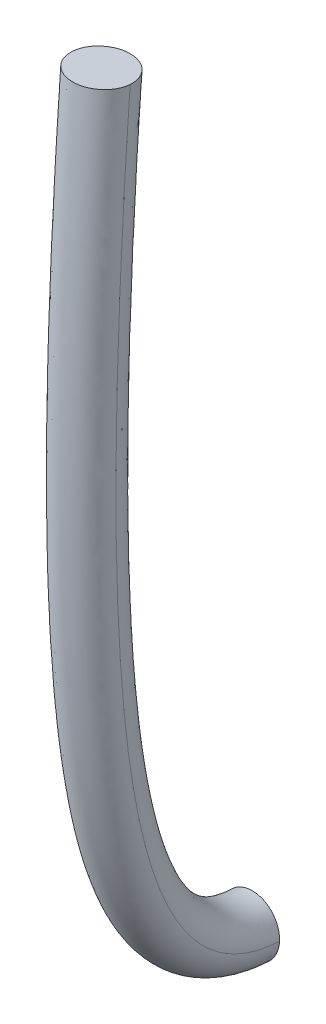
ISO-10303-21;
HEADER;
FILE_DESCRIPTION(('STEP AP214'),'2;1');
FILE_NAME('part.step','',(''),(''),'','','');
FILE_SCHEMA(('AUTOMOTIVE_DESIGN { 1 0 10303 214 1 1 1 1 }'));
ENDSEC;
DATA;
#1=APPLICATION_CONTEXT('core data for automotive mechanical design processes');
#2=APPLICATION_PROTOCOL_DEFINITION('international standard','automotive_design',2000,#1);
#3=PRODUCT_CONTEXT('',#1,'mechanical');
#4=PRODUCT('Part','Part','',(#3));
#5=PRODUCT_RELATED_PRODUCT_CATEGORY('part','',(#4));
#6=PRODUCT_DEFINITION_FORMATION('','',#4);
#7=PRODUCT_DEFINITION_CONTEXT('part definition',#1,'design');
#8=PRODUCT_DEFINITION('design','',#6,#7);
#9=PRODUCT_DEFINITION_SHAPE('','',#8);
#10=(LENGTH_UNIT() NAMED_UNIT(*) SI_UNIT(.MILLI.,.METRE.));
#11=(NAMED_UNIT(*) PLANE_ANGLE_UNIT() SI_UNIT($,.RADIAN.));
#12=(NAMED_UNIT(*) SI_UNIT($,.STERADIAN.) SOLID_ANGLE_UNIT());
#13=UNCERTAINTY_MEASURE_WITH_UNIT(LENGTH_MEASURE(1.E-05),#10,'distance_accuracy_value','');
#14=(GEOMETRIC_REPRESENTATION_CONTEXT(3) GLOBAL_UNCERTAINTY_ASSIGNED_CONTEXT((#13)) GLOBAL_UNIT_ASSIGNED_CONTEXT((#10,
#11,#12)) REPRESENTATION_CONTEXT('',''));
#15=CARTESIAN_POINT('',(0.,0.,0.));
#16=DIRECTION('',(0.,0.,1.));
#17=DIRECTION('',(1.,0.,0.));
#18=AXIS2_PLACEMENT_3D('',#15,#16,#17);
#19=CARTESIAN_POINT('',(-5.27289548724263,-7.28816544707048,13.8273298786737));
#20=CARTESIAN_POINT('',(-5.27289548724283,-7.27979947720606,13.9789787887425));
#21=CARTESIAN_POINT('',(-5.27289548724304,-7.19249943748985,14.2453726569304));
#22=CARTESIAN_POINT('',(-5.27289548724291,-6.82519562726373,14.5758428394149));
#23=CARTESIAN_POINT('',(-5.27289548724253,-6.16590455961052,14.8229446631191));
#24=CARTESIAN_POINT('',(-5.27289548724203,-5.06040179765682,14.9938956540655));
#25=CARTESIAN_POINT('',(-5.27289548724174,-3.38307014562794,15.0377995934823));
#26=CARTESIAN_POINT('',(-5.2728954872422,-1.84086870404001,14.9634806209142));
#27=CARTESIAN_POINT('',(-5.27289548724264,-1.00711460021713,14.9025870411617));
#28=CARTESIAN_POINT('',(-5.24379715545668,-7.22780437308972,13.8239999574387));
#29=CARTESIAN_POINT('',(-5.24379715545687,-7.21999159185813,13.9656212849807));
#30=CARTESIAN_POINT('',(-5.24379715545708,-7.14063321352236,14.2083493279636));
#31=CARTESIAN_POINT('',(-5.24379715545696,-6.79716208617297,14.5207896001784));
#32=CARTESIAN_POINT('',(-5.24379715545659,-6.15271535346113,14.7636530596226));
#33=CARTESIAN_POINT('',(-5.24379715545608,-5.05670222485791,14.9333271035938));
#34=CARTESIAN_POINT('',(-5.24379715545579,-3.38436676393499,14.9773480617736));
#35=CARTESIAN_POINT('',(-5.24379715545625,-1.84433177495748,14.9031196746293));
#36=CARTESIAN_POINT('',(-5.24379715545669,-1.01151807092496,14.8422947773688));
#37=CARTESIAN_POINT('',(-5.12729936381137,-7.13477609503237,13.8188678943702));
#38=CARTESIAN_POINT('',(-5.12729936381156,-7.1278155258013,13.9450412794592));
#39=CARTESIAN_POINT('',(-5.12729936381177,-7.06070215217801,14.1512961166985));
#40=CARTESIAN_POINT('',(-5.12729936381164,-6.75395266235516,14.4359557447663));
#41=CARTESIAN_POINT('',(-5.12729936381127,-6.1323830565793,14.6722810375099));
#42=CARTESIAN_POINT('',(-5.12729936381076,-5.05099597114022,14.839984442192));
#43=CARTESIAN_POINT('',(-5.12729936381048,-3.38636104659434,14.8841829340363));
#44=CARTESIAN_POINT('',(-5.12729936381093,-1.84966966052763,14.810091638123));
#45=CARTESIAN_POINT('',(-5.12729936381137,-1.01830468472103,14.7493725493346));
#46=CARTESIAN_POINT('',(-4.90938459812554,-7.18477729038485,13.8216262952934));
#47=CARTESIAN_POINT('',(-4.90938459812573,-7.17735938022325,13.9560898433595));
#48=CARTESIAN_POINT('',(-4.90938459812594,-7.10365399861126,14.1819474903361));
#49=CARTESIAN_POINT('',(-4.90938459812582,-6.77718534823178,14.4815250076562));
#50=CARTESIAN_POINT('',(-4.90938459812544,-6.14332144866162,14.7213762950583));
#51=CARTESIAN_POINT('',(-4.90938459812494,-5.05407181620375,14.8901440287118));
#52=CARTESIAN_POINT('',(-4.90938459812465,-3.38529714355021,14.934252639231));
#53=CARTESIAN_POINT('',(-4.9093845981251,-1.84679942765478,14.8600926155881));
#54=CARTESIAN_POINT('',(-4.90938459812555,-1.01465698953308,14.7993167445143));
#55=CARTESIAN_POINT('',(-4.84500000000135,-7.31847179552639,13.8290017798951));
#56=CARTESIAN_POINT('',(-4.84500000000155,-7.30982729388697,13.9856996012998));
#57=CARTESIAN_POINT('',(-4.84500000000175,-7.21855150146373,14.2639767583375));
#58=CARTESIAN_POINT('',(-4.84500000000162,-6.83926162727762,14.6035146924663));
#59=CARTESIAN_POINT('',(-4.84500000000125,-6.17251546983433,14.8527314417126));
#60=CARTESIAN_POINT('',(-4.84500000000075,-5.06224953339507,15.0243178802794));
#61=CARTESIAN_POINT('',(-4.84500000000046,-3.382410294947,15.0681569388591));
#62=CARTESIAN_POINT('',(-4.84500000000091,-1.83913128396928,14.99378700265));
#63=CARTESIAN_POINT('',(-4.84500000000136,-1.00490368664486,14.9328588411016));
#64=CARTESIAN_POINT('',(-4.845,-7.38568943191456,13.8327099550486));
#65=CARTESIAN_POINT('',(-4.84500000000019,-7.37642950308164,14.0005635497388));
#66=CARTESIAN_POINT('',(-4.84500000000039,-7.27630104779425,14.3051939892497));
#67=CARTESIAN_POINT('',(-4.84500000000026,-6.87048659892043,14.6647982664477));
#68=CARTESIAN_POINT('',(-4.84499999999989,-6.18721141687725,14.9187448304369));
#69=CARTESIAN_POINT('',(-4.84499999999939,-5.06637680995733,15.0917576140227));
#70=CARTESIAN_POINT('',(-4.8449999999991,-3.38097314559669,15.1354710442543));
#71=CARTESIAN_POINT('',(-4.84499999999955,-1.83527381521949,15.0610044224056));
#72=CARTESIAN_POINT('',(-4.845,-1.00000001490137,14.9999998509838));
#73=B_SPLINE_SURFACE_WITH_KNOTS('',3,3,((#19,#20,#21,#22,#23,#24,#25,#26,#27),(#28,#29,#30,#31,
#32,#33,#34,#35,#36),(#37,#38,#39,#40,#41,#42,#43,#44,#45),(#46,#47,#48,#49,#50,#51,#52,#53,
#54),(#55,#56,#57,#58,#59,#60,#61,#62,#63),(#64,#65,#66,#67,#68,#69,#70,#71,#72)),.UNSPECIFIED.,
.F.,.F.,.F.,(4,1,1,4),(4,1,1,1,1,1,4),(0.448798950512828,1.34639685153848,2.24399475256414,
3.14159265358979),(0.,0.142857142857143,0.285714285714286,0.428571428571429,0.571428571428571,
0.785714285714286,1.),.UNSPECIFIED.);
#74=CARTESIAN_POINT('',(-4.845,-7.38568943191456,13.8327099550486));
#75=CARTESIAN_POINT('',(-4.84500000000019,-7.37642950308164,14.0005635497388));
#76=CARTESIAN_POINT('',(-4.84500000000039,-7.27630104779425,14.3051939892497));
#77=CARTESIAN_POINT('',(-4.84500000000026,-6.87048659892043,14.6647982664477));
#78=CARTESIAN_POINT('',(-4.84499999999989,-6.18721141687725,14.9187448304369));
#79=CARTESIAN_POINT('',(-4.84499999999939,-5.06637680995733,15.0917576140227));
#80=CARTESIAN_POINT('',(-4.8449999999991,-3.38097314559669,15.1354710442543));
#81=CARTESIAN_POINT('',(-4.84499999999955,-1.83527381521949,15.0610044224056));
#82=CARTESIAN_POINT('',(-4.845,-1.00000001490137,14.9999998509838));
#83=B_SPLINE_CURVE_WITH_KNOTS('',3,(#74,#75,#76,#77,#78,#79,#80,#81,#82),.UNSPECIFIED.,.F.,.F.,
(4,1,1,1,1,1,4),(0.,0.142857142857143,0.285714285714286,0.428571428571429,0.571428571428571,
0.785714285714286,1.),.UNSPECIFIED.);
#84=CARTESIAN_POINT('',(-4.845,-7.38568943191456,13.8327099550486));
#85=VERTEX_POINT('',#84);
#86=CARTESIAN_POINT('',(-4.845,-1.00000001490137,14.9999998509838));
#87=VERTEX_POINT('',#86);
#88=EDGE_CURVE('E11',#85,#87,#83,.T.);
#89=CARTESIAN_POINT('',(-4.845,-7.38568943191456,13.8327099550486));
#90=CARTESIAN_POINT('',(-4.84497847415767,-7.4110270881352,13.8341077499176));
#91=CARTESIAN_POINT('',(-4.84947322099431,-7.43643730784373,13.8355095478747));
#92=CARTESIAN_POINT('',(-4.86641979035294,-7.48438622869311,13.8381547315867));
#93=CARTESIAN_POINT('',(-4.87886645637275,-7.50692677934839,13.8393982193732));
#94=CARTESIAN_POINT('',(-4.91068341580595,-7.54640620250965,13.8415761688506));
#95=CARTESIAN_POINT('',(-4.93004036434348,-7.56335575159643,13.8425112195332));
#96=CARTESIAN_POINT('',(-4.97308062026943,-7.58995895352275,13.8439788303819));
#97=CARTESIAN_POINT('',(-4.99673568981949,-7.599658228531,13.8445139073724));
#98=CARTESIAN_POINT('',(-5.04600153650225,-7.61052254998054,13.84511325613));
#99=CARTESIAN_POINT('',(-5.07161741475389,-7.61166451545368,13.8451762545961));
#100=CARTESIAN_POINT('',(-5.12188710178593,-7.60564066732368,13.8448439387759));
#101=CARTESIAN_POINT('',(-5.14653941385386,-7.59846242170475,13.8444479386563));
#102=CARTESIAN_POINT('',(-5.19200107952252,-7.57620585424343,13.8432201172852));
#103=CARTESIAN_POINT('',(-5.21280462824726,-7.56111572866897,13.8423876448609));
#104=CARTESIAN_POINT('',(-5.24850403886139,-7.5249538193773,13.8403927116745));
#105=CARTESIAN_POINT('',(-5.26337649945534,-7.50385889334491,13.8392289742272));
#106=CARTESIAN_POINT('',(-5.28455500615893,-7.45822808230441,13.8367116729826));
#107=CARTESIAN_POINT('',(-5.29102975924534,-7.43377124817415,13.8353624701613));
#108=CARTESIAN_POINT('',(-5.29479265193478,-7.3965248169106,13.8333077074771));
#109=CARTESIAN_POINT('',(-5.29503698930088,-7.38393139287266,13.8326129698364));
#110=CARTESIAN_POINT('',(-5.29350194394068,-7.3588565987858,13.8312296762038));
#111=CARTESIAN_POINT('',(-5.29172358135648,-7.34637517544837,13.8305411172722));
#112=CARTESIAN_POINT('',(-5.28600529502433,-7.32135603600862,13.8291608939228));
#113=CARTESIAN_POINT('',(-5.28197761729317,-7.30883802486994,13.8284703165628));
#114=CARTESIAN_POINT('',(-5.27166559762405,-7.28476924270971,13.827142521288));
#115=CARTESIAN_POINT('',(-5.26538268387071,-7.27321786523924,13.8265052699173));
#116=CARTESIAN_POINT('',(-5.25138744901714,-7.25220867643668,13.8253462623101));
#117=CARTESIAN_POINT('',(-5.24380998711596,-7.24266012748231,13.8248195003784));
#118=CARTESIAN_POINT('',(-5.22724507533855,-7.22485215564251,13.8238370933457));
#119=CARTESIAN_POINT('',(-5.21825573172552,-7.21659449432438,13.8233815454245));
#120=CARTESIAN_POINT('',(-5.19850548617428,-7.20109607502702,13.8225265487831));
#121=CARTESIAN_POINT('',(-5.18766897456367,-7.19395113600727,13.8221323860786));
#122=CARTESIAN_POINT('',(-5.16496216225167,-7.18157859046832,13.8214498335757));
#123=CARTESIAN_POINT('',(-5.15309336245596,-7.17634825601238,13.8211612932861));
#124=CARTESIAN_POINT('',(-5.12865935246965,-7.16811847106196,13.8207072832121));
#125=CARTESIAN_POINT('',(-5.11609777377959,-7.16510839174327,13.8205412270706));
#126=CARTESIAN_POINT('',(-5.09063463906853,-7.161401132664,13.8203367098227));
#127=CARTESIAN_POINT('',(-5.0777328737575,-7.16070541186808,13.8202983292026));
#128=CARTESIAN_POINT('',(-5.05271571352024,-7.16145742012051,13.820339815016));
#129=CARTESIAN_POINT('',(-5.04059625347407,-7.1627888524724,13.8204132657445));
#130=CARTESIAN_POINT('',(-5.01670425063249,-7.16730878514178,13.8206626155123));
#131=CARTESIAN_POINT('',(-5.00493188921285,-7.17049823890927,13.8208385671502));
#132=CARTESIAN_POINT('',(-4.98111915635603,-7.17899409206104,13.8213072553288));
#133=CARTESIAN_POINT('',(-4.96913068832415,-7.18444742351354,13.8216080976267));
#134=CARTESIAN_POINT('',(-4.94632125863665,-7.19737198447044,13.8223211029983));
#135=CARTESIAN_POINT('',(-4.93549865874493,-7.20484032939948,13.8227331069395));
#136=CARTESIAN_POINT('',(-4.90644720602132,-7.22920390930079,13.8240771652329));
#137=CARTESIAN_POINT('',(-4.89023438705608,-7.24856194734145,13.825145084302));
#138=CARTESIAN_POINT('',(-4.8646410792603,-7.29145296493362,13.8275112401845));
#139=CARTESIAN_POINT('',(-4.85530314657342,-7.31501084571109,13.8288108507163));
#140=CARTESIAN_POINT('',(-4.84672885379226,-7.35460392638949,13.8309950703038));
#141=CARTESIAN_POINT('',(-4.84501321610968,-7.37013300264753,13.8318517581886));
#142=CARTESIAN_POINT('',(-4.845,-7.38568943191456,13.8327099550486));
#143=B_SPLINE_CURVE_WITH_KNOTS('',3,(#89,#90,#91,#92,#93,#94,#95,#96,#97,#98,#99,#100,#101,#102,
#103,#104,#105,#106,#107,#108,#109,#110,#111,#112,#113,#114,#115,#116,#117,#118,#119,#120,#121,
#122,#123,#124,#125,#126,#127,#128,#129,#130,#131,#132,#133,#134,#135,#136,#137,#138,#139,#140,
#141,#142),.UNSPECIFIED.,.T.,.F.,(4,2,2,2,2,2,2,2,2,2,2,2,2,2,2,2,2,2,2,2,2,2,2,2,2,2,4),(0.,
0.0759556944633894,0.151862184614655,0.227622873027156,0.302902730628832,0.378385561922837,
0.453981324819257,0.529690191288069,0.605694882282272,0.680147726911943,0.717871934830117,
0.755577125100554,0.794867909351082,0.834133855500916,0.870583238371331,0.907081934487411,
0.945861906182154,0.984586406940069,1.0231243004168,1.06168648346651,1.09811820249087,
1.13456863306412,1.17388958466093,1.2131545426347,1.28748095512165,1.36226367279545,
1.40889779625419),.UNSPECIFIED.);
#144=CARTESIAN_POINT('',(-5.27289548724264,-7.28816544707048,13.8273298786738));
#145=VERTEX_POINT('',#144);
#146=EDGE_CURVE('E45',#145,#85,#143,.T.);
#147=CARTESIAN_POINT('',(-5.27289548724263,-7.28816544707048,13.8273298786737));
#148=CARTESIAN_POINT('',(-5.27289548724283,-7.27979947720606,13.9789787887425));
#149=CARTESIAN_POINT('',(-5.27289548724304,-7.19249943748985,14.2453726569304));
#150=CARTESIAN_POINT('',(-5.27289548724291,-6.82519562726373,14.5758428394149));
#151=CARTESIAN_POINT('',(-5.27289548724253,-6.16590455961052,14.8229446631191));
#152=CARTESIAN_POINT('',(-5.27289548724203,-5.06040179765682,14.9938956540655));
#153=CARTESIAN_POINT('',(-5.27289548724174,-3.38307014562794,15.0377995934823));
#154=CARTESIAN_POINT('',(-5.2728954872422,-1.84086870404001,14.9634806209142));
#155=CARTESIAN_POINT('',(-5.27289548724264,-1.00711460021713,14.9025870411617));
#156=B_SPLINE_CURVE_WITH_KNOTS('',3,(#147,#148,#149,#150,#151,#152,#153,#154,#155),
.UNSPECIFIED.,.F.,.F.,(4,1,1,1,1,1,4),(0.,0.142857142857143,0.285714285714286,0.428571428571429,
0.571428571428571,0.785714285714286,1.),.UNSPECIFIED.);
#157=CARTESIAN_POINT('',(-5.27289548724264,-1.00711460021713,14.9025870411617));
#158=VERTEX_POINT('',#157);
#159=EDGE_CURVE('E29',#145,#158,#156,.T.);
#160=CARTESIAN_POINT('',(-4.845,-1.00000001490137,14.9999998509838));
#161=CARTESIAN_POINT('',(-4.84501097548697,-1.00092508162962,14.9873338493442));
#162=CARTESIAN_POINT('',(-4.84615103910393,-1.00185042185208,14.9746641030254));
#163=CARTESIAN_POINT('',(-4.85057441529783,-1.00367505966439,14.9496811857757));
#164=CARTESIAN_POINT('',(-4.85386279374645,-1.00457429043847,14.9373689296853));
#165=CARTESIAN_POINT('',(-4.86239293289763,-1.00631909170807,14.9134791333424));
#166=CARTESIAN_POINT('',(-4.86762901994641,-1.00716480979378,14.9018995722867));
#167=CARTESIAN_POINT('',(-4.87991155634525,-1.00878259827519,14.8797488333917));
#168=CARTESIAN_POINT('',(-4.88695673625286,-1.00955471979483,14.8691769555638));
#169=CARTESIAN_POINT('',(-4.90296394381425,-1.01102540400624,14.8490403664247));
#170=CARTESIAN_POINT('',(-4.91197814860759,-1.01172098317568,14.8395165054626));
#171=CARTESIAN_POINT('',(-4.93161542803285,-1.01297832832624,14.8223009519764));
#172=CARTESIAN_POINT('',(-4.94223741689136,-1.01354018396016,14.8146080319274));
#173=CARTESIAN_POINT('',(-4.96388981259282,-1.01448281005278,14.8017016076989));
#174=CARTESIAN_POINT('',(-4.97484008463752,-1.01487347616387,14.7963526123751));
#175=CARTESIAN_POINT('',(-4.9974571169487,-1.01552564828865,14.7874230801053));
#176=CARTESIAN_POINT('',(-5.00912483838782,-1.0157869765939,14.7838449763409));
#177=CARTESIAN_POINT('',(-5.03360600506706,-1.01618688204226,14.7783694761313));
#178=CARTESIAN_POINT('',(-5.04644582012378,-1.01631694204522,14.7765886962585));
#179=CARTESIAN_POINT('',(-5.07223089855849,-1.01641890448108,14.7751926279099));
#180=CARTESIAN_POINT('',(-5.08517598803038,-1.01639102932016,14.7755742942516));
#181=CARTESIAN_POINT('',(-5.1107559093497,-1.01616719134095,14.7786390809586));
#182=CARTESIAN_POINT('',(-5.12339159671446,-1.01597176317861,14.7813148808216));
#183=CARTESIAN_POINT('',(-5.14797181977545,-1.01541775084992,14.7889004104374));
#184=CARTESIAN_POINT('',(-5.15991594296075,-1.01505907041273,14.7938114583293));
#185=CARTESIAN_POINT('',(-5.18216813899399,-1.01422532097814,14.8052271447693));
#186=CARTESIAN_POINT('',(-5.1925302023355,-1.0137578066214,14.8116283452754));
#187=CARTESIAN_POINT('',(-5.21214314082974,-1.01271154012388,14.8259538125833));
#188=CARTESIAN_POINT('',(-5.22139337410771,-1.01213272422369,14.8338789523782));
#189=CARTESIAN_POINT('',(-5.23923657441253,-1.01082663878343,14.8517618572788));
#190=CARTESIAN_POINT('',(-5.24771790313102,-1.01009120115275,14.8618314597751));
#191=CARTESIAN_POINT('',(-5.26275957285925,-1.00852463544684,14.8832808570928));
#192=CARTESIAN_POINT('',(-5.2693227331093,-1.00769365033369,14.8946586944795));
#193=CARTESIAN_POINT('',(-5.28509048720766,-1.00517376824406,14.929160887353));
#194=CARTESIAN_POINT('',(-5.29140041664153,-1.00338278315717,14.9536830319231));
#195=CARTESIAN_POINT('',(-5.29486928820332,-1.00066660641845,14.9908728885849));
#196=CARTESIAN_POINT('',(-5.29501455042498,-0.999752521037453,15.0033885337605));
#197=CARTESIAN_POINT('',(-5.29330708079217,-0.997933353264187,15.0282965553067));
#198=CARTESIAN_POINT('',(-5.29145564744456,-0.997028265406675,15.0406890065074));
#199=CARTESIAN_POINT('',(-5.28560263146055,-0.995209213339131,15.0655954438123));
#200=CARTESIAN_POINT('',(-5.28150164949534,-0.994296926548662,15.0780864627097));
#201=CARTESIAN_POINT('',(-5.27106262898264,-0.992542752751662,15.1021045875762));
#202=CARTESIAN_POINT('',(-5.26472491069036,-0.991700855688086,15.1136318312462));
#203=CARTESIAN_POINT('',(-5.25058602213519,-0.990164780090974,15.1346637583898));
#204=CARTESIAN_POINT('',(-5.24290753683838,-0.989464543865855,15.1442513836979));
#205=CARTESIAN_POINT('',(-5.22611418656071,-0.988162062076395,15.1620849474582));
#206=CARTESIAN_POINT('',(-5.21699876133972,-0.987559854918958,15.1703303600436));
#207=CARTESIAN_POINT('',(-5.19713917791722,-0.986445264874192,15.1855913124736));
#208=CARTESIAN_POINT('',(-5.1863415573968,-0.985937905290243,15.1925380733135));
#209=CARTESIAN_POINT('',(-5.16370073269004,-0.985068044990207,15.2044481892542));
#210=CARTESIAN_POINT('',(-5.15185791530142,-0.984705490957872,15.2094122743604));
#211=CARTESIAN_POINT('',(-5.12775045901683,-0.984138147074207,15.2171803394536));
#212=CARTESIAN_POINT('',(-5.1154992036082,-0.9839303135008,15.2200259940438));
#213=CARTESIAN_POINT('',(-5.09069326615155,-0.983662392091959,15.2236943704969));
#214=CARTESIAN_POINT('',(-5.07813848432628,-0.983602353526329,15.2245164177584));
#215=CARTESIAN_POINT('',(-5.05273623508237,-0.983633609096825,15.2240884668925));
#216=CARTESIAN_POINT('',(-5.03988951372568,-0.983728821503712,15.2227848198528));
#217=CARTESIAN_POINT('',(-5.01462981519077,-0.98408266426306,15.217940009383));
#218=CARTESIAN_POINT('',(-5.00221671500175,-0.984341247866072,15.2143994860459));
#219=CARTESIAN_POINT('',(-4.97854671795792,-0.984998826205311,15.2053959319575));
#220=CARTESIAN_POINT('',(-4.96726627034472,-0.985393362029234,15.1999939525757));
#221=CARTESIAN_POINT('',(-4.94573314611426,-0.986310625632451,15.1874347912226));
#222=CARTESIAN_POINT('',(-4.93548066863452,-0.98683337818245,15.1802772700912));
#223=CARTESIAN_POINT('',(-4.91604587321701,-0.988010407476623,15.1641614002682));
#224=CARTESIAN_POINT('',(-4.90689803825202,-0.988667732742994,15.1551613112503));
#225=CARTESIAN_POINT('',(-4.89032497692097,-0.990087493103763,15.1357219708132));
#226=CARTESIAN_POINT('',(-4.88289963970247,-0.99084992142915,15.1252828120752));
#227=CARTESIAN_POINT('',(-4.86379254477249,-0.993218533901096,15.0928518008441));
#228=CARTESIAN_POINT('',(-4.85470195131041,-0.994942269536303,15.0692504348938));
#229=CARTESIAN_POINT('',(-4.84657118884221,-0.997799847823488,15.0301245100651));
#230=CARTESIAN_POINT('',(-4.84498694572465,-0.99889973790915,15.0150648292842));
#231=CARTESIAN_POINT('',(-4.845,-1.00000001490137,14.9999998509838));
#232=B_SPLINE_CURVE_WITH_KNOTS('',3,(#160,#161,#162,#163,#164,#165,#166,#167,#168,#169,#170,
#171,#172,#173,#174,#175,#176,#177,#178,#179,#180,#181,#182,#183,#184,#185,#186,#187,#188,#189,
#190,#191,#192,#193,#194,#195,#196,#197,#198,#199,#200,#201,#202,#203,#204,#205,#206,#207,#208,
#209,#210,#211,#212,#213,#214,#215,#216,#217,#218,#219,#220,#221,#222,#223,#224,#225,#226,#227,
#228,#229,#230,#231),.UNSPECIFIED.,.T.,.F.,(4,2,2,2,2,2,2,2,2,2,2,2,2,2,2,2,2,2,2,2,2,2,2,2,2,2,
2,2,2,2,2,2,2,2,2,4),(0.,0.038061764108685,0.0762136059710827,0.114255171327303,
0.152270115474761,0.191451348215509,0.230606238062134,0.267030675037744,0.303505020726774,
0.342217718461339,0.380875914076636,0.419411209872623,0.457969259665665,0.494389744761906,
0.530831155928446,0.570185415776522,0.609481540171978,0.683954133489126,0.721494140508779,
0.759009748927744,0.798334817127501,0.837654257058905,0.874404473940575,0.911169054750214,
0.949526795126805,0.987870399441666,1.0254381708938,1.06301846446157,1.10156198341511,
1.14009447794859,1.17746757477839,1.21484789756168,1.25319376372407,1.29153716142892,
1.36604622970107,1.41131699996353),.UNSPECIFIED.);
#233=EDGE_CURVE('E48',#87,#158,#232,.T.);
#234=ORIENTED_EDGE('',*,*,#88,.F.);
#235=ORIENTED_EDGE('',*,*,#146,.F.);
#236=ORIENTED_EDGE('',*,*,#159,.T.);
#237=ORIENTED_EDGE('',*,*,#233,.F.);
#238=EDGE_LOOP('',(#234,#235,#236,#237));
#239=FACE_BOUND('',#238,.T.);
#240=ADVANCED_FACE('F17',(#239),#73,.F.);
#241=CARTESIAN_POINT('',(-5.07,-1.00000001490116,14.9999998509884));
#242=DIRECTION('',(5.3263280686712E-13,-0.997343536648528,0.0728414024124084));
#243=DIRECTION('',(0.,-0.0728414024124084,-0.997343536648528));
#244=AXIS2_PLACEMENT_3D('',#241,#242,#243);
#245=PLANE('',#244);
#246=ORIENTED_EDGE('',*,*,#233,.T.);
#247=EDGE_CURVE('E80',#158,#87,#232,.T.);
#248=ORIENTED_EDGE('',*,*,#247,.T.);
#249=EDGE_LOOP('',(#246,#248));
#250=FACE_BOUND('',#249,.T.);
#251=ADVANCED_FACE('F72',(#250),#245,.F.);
#252=CARTESIAN_POINT('',(-5.07,-7.38568943191911,13.8327099550486));
#253=DIRECTION('',(1.11236968520861E-12,-0.0550829445172842,-0.998481782118886));
#254=DIRECTION('',(0.,0.998481782118886,-0.0550829445172842));
#255=AXIS2_PLACEMENT_3D('',#252,#253,#254);
#256=PLANE('',#255);
#257=EDGE_CURVE('E52',#85,#145,#143,.T.);
#258=ORIENTED_EDGE('',*,*,#257,.T.);
#259=ORIENTED_EDGE('',*,*,#146,.T.);
#260=EDGE_LOOP('',(#258,#259));
#261=FACE_BOUND('',#260,.T.);
#262=ADVANCED_FACE('F51',(#261),#256,.T.);
#263=CARTESIAN_POINT('',(-4.845,-7.38568943191456,13.8327099550486));
#264=CARTESIAN_POINT('',(-4.84500000000019,-7.37642950308164,14.0005635497388));
#265=CARTESIAN_POINT('',(-4.84500000000039,-7.27630104779425,14.3051939892497));
#266=CARTESIAN_POINT('',(-4.84500000000026,-6.87048659892043,14.6647982664477));
#267=CARTESIAN_POINT('',(-4.84499999999989,-6.18721141687725,14.9187448304369));
#268=CARTESIAN_POINT('',(-4.84499999999939,-5.06637680995733,15.0917576140227));
#269=CARTESIAN_POINT('',(-4.8449999999991,-3.38097314559669,15.1354710442543));
#270=CARTESIAN_POINT('',(-4.84499999999955,-1.83527381521949,15.0610044224056));
#271=CARTESIAN_POINT('',(-4.845,-1.00000001490137,14.9999998509838));
#272=CARTESIAN_POINT('',(-4.84499999999898,-7.43610265920569,13.8354910864138));
#273=CARTESIAN_POINT('',(-4.84499999999917,-7.42638032085317,14.0117267217746));
#274=CARTESIAN_POINT('',(-4.84499999999937,-7.3196248101388,14.3361232455076));
#275=CARTESIAN_POINT('',(-4.84499999999924,-6.89389548496225,14.7107935572907));
#276=CARTESIAN_POINT('',(-4.84499999999886,-6.19822141423956,14.9682734790834));
#277=CARTESIAN_POINT('',(-4.84499999999836,-5.06946182513089,15.1423499375233));
#278=CARTESIAN_POINT('',(-4.84499999999808,-3.37988582843197,15.1859625917761));
#279=CARTESIAN_POINT('',(-4.84499999999853,-1.83238214013707,15.1114175914059));
#280=CARTESIAN_POINT('',(-4.84499999999898,-0.996322261093759,15.0503556083956));
#281=CARTESIAN_POINT('',(-4.86853147469467,-7.50310540395874,13.8391874067051));
#282=CARTESIAN_POINT('',(-4.86853147469485,-7.49276894230403,14.0265551798734));
#283=CARTESIAN_POINT('',(-4.86853147469506,-7.37719890949798,14.3772216234661));
#284=CARTESIAN_POINT('',(-4.86853147469493,-6.92501284798785,14.7719069996417));
#285=CARTESIAN_POINT('',(-4.86853147469455,-6.21286091845217,15.0340905410581));
#286=CARTESIAN_POINT('',(-4.86853147469405,-5.07356764899256,15.2095839732507));
#287=CARTESIAN_POINT('',(-4.86853147469376,-3.37844579621038,15.2530662171487));
#288=CARTESIAN_POINT('',(-4.86853147469422,-1.82853813163018,15.1784202026099));
#289=CARTESIAN_POINT('',(-4.86853147469466,-0.991434266159166,15.1172819716141));
#290=CARTESIAN_POINT('',(-4.94051636871301,-7.57470614404714,13.8431373832237));
#291=CARTESIAN_POINT('',(-4.9405163687132,-7.56371393629669,14.0423917854757));
#292=CARTESIAN_POINT('',(-4.9405163687134,-7.43871677193423,14.4211301989218));
#293=CARTESIAN_POINT('',(-4.94051636871327,-6.9582717172311,14.8371940506242));
#294=CARTESIAN_POINT('',(-4.94051636871289,-6.22851246845042,15.104412683771));
#295=CARTESIAN_POINT('',(-4.94051636871239,-5.07796171172958,15.2814241040219));
#296=CARTESIAN_POINT('',(-4.94051636871211,-3.37691281148901,15.3247710564097));
#297=CARTESIAN_POINT('',(-4.94051636871256,-1.82442944661097,15.250020735324));
#298=CARTESIAN_POINT('',(-4.940516368713,-0.98621083753466,15.1888010885627));
#299=CARTESIAN_POINT('',(-5.03383446316023,-7.61993974614557,13.8456327717618));
#300=CARTESIAN_POINT('',(-5.03383446316042,-7.60853246182453,14.0524112161208));
#301=CARTESIAN_POINT('',(-5.03383446316062,-7.47759174604026,14.4488851157213));
#302=CARTESIAN_POINT('',(-5.03383446316049,-6.97927342420756,14.878470491768));
#303=CARTESIAN_POINT('',(-5.03383446316011,-6.23838874430215,15.1488565070793));
#304=CARTESIAN_POINT('',(-5.03383446315961,-5.08072756479718,15.3268210364779));
#305=CARTESIAN_POINT('',(-5.03383446315933,-3.37593521943291,15.3700761877248));
#306=CARTESIAN_POINT('',(-5.03383446315978,-1.8218351721465,15.2952543070426));
#307=CARTESIAN_POINT('',(-5.03383446316022,-0.982910948571265,15.2339831254312));
#308=CARTESIAN_POINT('',(-5.17504966023638,-7.60399545974881,13.8447531781038));
#309=CARTESIAN_POINT('',(-5.17504966023656,-7.59273465848231,14.0488763420925));
#310=CARTESIAN_POINT('',(-5.17504966023676,-7.4638863959496,14.4390984694284));
#311=CARTESIAN_POINT('',(-5.17504966023663,-6.97187261903131,14.8639143058801));
#312=CARTESIAN_POINT('',(-5.17504966023626,-6.23490995512765,15.1331867565504));
#313=CARTESIAN_POINT('',(-5.17504966023576,-5.07975479712877,15.3108165860225));
#314=CARTESIAN_POINT('',(-5.17504966023547,-3.37628176564837,15.3541054527722));
#315=CARTESIAN_POINT('',(-5.17504966023593,-1.8227493266116,15.2793100097898));
#316=CARTESIAN_POINT('',(-5.17504966023637,-0.98407411869863,15.2180570151415));
#317=CARTESIAN_POINT('',(-5.30190241258977,-7.47839053668371,13.8378239690463));
#318=CARTESIAN_POINT('',(-5.30190241258996,-7.468280903472,14.021080050839));
#319=CARTESIAN_POINT('',(-5.30190241259017,-7.35595776666728,14.3620560774238));
#320=CARTESIAN_POINT('',(-5.30190241259004,-6.91353831633157,14.7493527924936));
#321=CARTESIAN_POINT('',(-5.30190241258966,-6.20746522751116,15.0098063595051));
#322=CARTESIAN_POINT('',(-5.30190241258916,-5.07205690324895,15.1847793024615));
#323=CARTESIAN_POINT('',(-5.30190241258888,-3.37898036057315,15.2283119994014));
#324=CARTESIAN_POINT('',(-5.30190241258932,-1.82995553478528,15.1537053472535));
#325=CARTESIAN_POINT('',(-5.30190241258977,-0.993237269103455,15.0925952786996));
#326=CARTESIAN_POINT('',(-5.30199381902859,-7.34852652105124,13.8306597999087));
#327=CARTESIAN_POINT('',(-5.30199381902878,-7.33960736255399,13.9923362925042));
#328=CARTESIAN_POINT('',(-5.30199381902899,-7.24436566145735,14.2823959858971));
#329=CARTESIAN_POINT('',(-5.30199381902886,-6.85322916835449,14.6308960786514));
#330=CARTESIAN_POINT('',(-5.30199381902848,-6.17909376575991,14.8822362666157));
#331=CARTESIAN_POINT('',(-5.30199381902798,-5.06410137045573,15.0544642045372));
#332=CARTESIAN_POINT('',(-5.3019938190277,-3.38177352732089,15.0982511251911));
#333=CARTESIAN_POINT('',(-5.30199381902815,-1.83740563312254,15.0238415671992));
#334=CARTESIAN_POINT('',(-5.30199381902859,-1.0027111295093,14.9628793049545));
#335=CARTESIAN_POINT('',(-5.27289548724263,-7.28816544707048,13.8273298786737));
#336=CARTESIAN_POINT('',(-5.27289548724283,-7.27979947720606,13.9789787887425));
#337=CARTESIAN_POINT('',(-5.27289548724304,-7.19249943748985,14.2453726569304));
#338=CARTESIAN_POINT('',(-5.27289548724291,-6.82519562726373,14.5758428394149));
#339=CARTESIAN_POINT('',(-5.27289548724253,-6.16590455961052,14.8229446631191));
#340=CARTESIAN_POINT('',(-5.27289548724203,-5.06040179765682,14.9938956540655));
#341=CARTESIAN_POINT('',(-5.27289548724174,-3.38307014562794,15.0377995934823));
#342=CARTESIAN_POINT('',(-5.2728954872422,-1.84086870404001,14.9634806209142));
#343=CARTESIAN_POINT('',(-5.27289548724264,-1.00711460021713,14.9025870411617));
#344=B_SPLINE_SURFACE_WITH_KNOTS('',3,3,((#263,#264,#265,#266,#267,#268,#269,#270,#271),(#272,
#273,#274,#275,#276,#277,#278,#279,#280),(#281,#282,#283,#284,#285,#286,#287,#288,#289),(#290,
#291,#292,#293,#294,#295,#296,#297,#298),(#299,#300,#301,#302,#303,#304,#305,#306,#307),(#308,
#309,#310,#311,#312,#313,#314,#315,#316),(#317,#318,#319,#320,#321,#322,#323,#324,#325),(#326,
#327,#328,#329,#330,#331,#332,#333,#334),(#335,#336,#337,#338,#339,#340,#341,#342,#343)),
.UNSPECIFIED.,.F.,.F.,.F.,(4,1,1,1,1,1,4),(4,1,1,1,1,1,4),(-3.14159265358979,-2.46839422782055,
-2.24399475256414,-1.79519580205131,-1.12199737628207,-0.448798950512828,0.448798950512828),(0.,
0.142857142857143,0.285714285714286,0.428571428571429,0.571428571428571,0.785714285714286,1.),.UNSPECIFIED.);
#345=ORIENTED_EDGE('',*,*,#257,.F.);
#346=ORIENTED_EDGE('',*,*,#88,.T.);
#347=ORIENTED_EDGE('',*,*,#247,.F.);
#348=ORIENTED_EDGE('',*,*,#159,.F.);
#349=EDGE_LOOP('',(#345,#346,#347,#348));
#350=FACE_BOUND('',#349,.T.);
#351=ADVANCED_FACE('F54',(#350),#344,.F.);
#352=CLOSED_SHELL('',(#240,#251,#262,#351));
#353=MANIFOLD_SOLID_BREP('B1',#352);
#354=ADVANCED_BREP_SHAPE_REPRESENTATION('',(#18,#353),#14);
#355=SHAPE_DEFINITION_REPRESENTATION(#9,#354);
ENDSEC;
END-ISO-10303-21;
